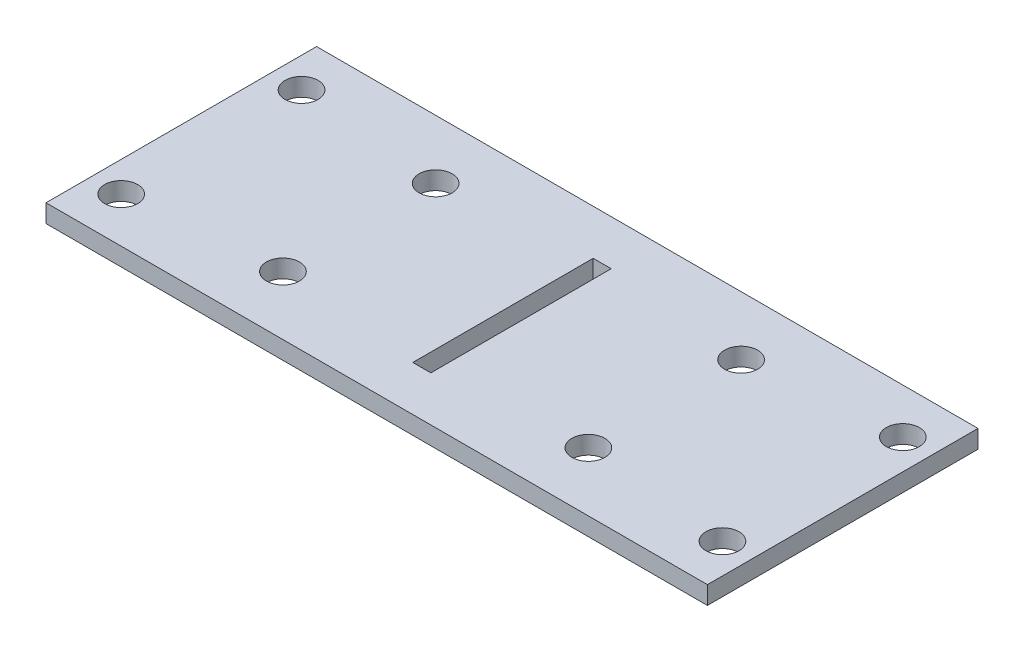
ISO-10303-21;
HEADER;
FILE_DESCRIPTION(('STEP AP214'),'2;1');
FILE_NAME('part.step','',(''),(''),'','','');
FILE_SCHEMA(('AUTOMOTIVE_DESIGN { 1 0 10303 214 1 1 1 1 }'));
ENDSEC;
DATA;
#1=APPLICATION_CONTEXT('core data for automotive mechanical design processes');
#2=APPLICATION_PROTOCOL_DEFINITION('international standard','automotive_design',2000,#1);
#3=PRODUCT_CONTEXT('',#1,'mechanical');
#4=PRODUCT('Part','Part','',(#3));
#5=PRODUCT_RELATED_PRODUCT_CATEGORY('part','',(#4));
#6=PRODUCT_DEFINITION_FORMATION('','',#4);
#7=PRODUCT_DEFINITION_CONTEXT('part definition',#1,'design');
#8=PRODUCT_DEFINITION('design','',#6,#7);
#9=PRODUCT_DEFINITION_SHAPE('','',#8);
#10=(LENGTH_UNIT() NAMED_UNIT(*) SI_UNIT(.MILLI.,.METRE.));
#11=(NAMED_UNIT(*) PLANE_ANGLE_UNIT() SI_UNIT($,.RADIAN.));
#12=(NAMED_UNIT(*) SI_UNIT($,.STERADIAN.) SOLID_ANGLE_UNIT());
#13=UNCERTAINTY_MEASURE_WITH_UNIT(LENGTH_MEASURE(1.E-05),#10,'distance_accuracy_value','');
#14=(GEOMETRIC_REPRESENTATION_CONTEXT(3) GLOBAL_UNCERTAINTY_ASSIGNED_CONTEXT((#13)) GLOBAL_UNIT_ASSIGNED_CONTEXT((#10,
#11,#12)) REPRESENTATION_CONTEXT('',''));
#15=CARTESIAN_POINT('',(0.,0.,0.));
#16=DIRECTION('',(0.,0.,1.));
#17=DIRECTION('',(1.,0.,0.));
#18=AXIS2_PLACEMENT_3D('',#15,#16,#17);
#19=CARTESIAN_POINT('',(0.,3.,0.));
#20=DIRECTION('',(0.,-1.,0.));
#21=DIRECTION('',(0.,0.,-1.));
#22=AXIS2_PLACEMENT_3D('',#19,#20,#21);
#23=PLANE('',#22);
#24=CARTESIAN_POINT('',(-25.4,3.,12.7));
#25=DIRECTION('',(0.,1.,0.));
#26=DIRECTION('',(0.,0.,1.));
#27=AXIS2_PLACEMENT_3D('',#24,#25,#26);
#28=CIRCLE('',#27,2.75);
#29=CARTESIAN_POINT('',(-25.4,3.,15.45));
#30=VERTEX_POINT('',#29);
#31=EDGE_CURVE('E288',#30,#30,#28,.T.);
#32=ORIENTED_EDGE('',*,*,#31,.F.);
#33=EDGE_LOOP('',(#32));
#34=FACE_BOUND('',#33,.T.);
#35=CARTESIAN_POINT('',(25.4,3.,-12.7));
#36=DIRECTION('',(0.,1.,0.));
#37=DIRECTION('',(0.,0.,1.));
#38=AXIS2_PLACEMENT_3D('',#35,#36,#37);
#39=CIRCLE('',#38,2.75);
#40=CARTESIAN_POINT('',(25.4,3.,-9.95));
#41=VERTEX_POINT('',#40);
#42=EDGE_CURVE('E292',#41,#41,#39,.T.);
#43=ORIENTED_EDGE('',*,*,#42,.F.);
#44=EDGE_LOOP('',(#43));
#45=FACE_BOUND('',#44,.T.);
#46=CARTESIAN_POINT('',(-25.4,3.,-12.7));
#47=DIRECTION('',(0.,1.,0.));
#48=DIRECTION('',(0.,0.,1.));
#49=AXIS2_PLACEMENT_3D('',#46,#47,#48);
#50=CIRCLE('',#49,2.75);
#51=CARTESIAN_POINT('',(-25.4,3.,-9.95));
#52=VERTEX_POINT('',#51);
#53=EDGE_CURVE('E302',#52,#52,#50,.T.);
#54=ORIENTED_EDGE('',*,*,#53,.F.);
#55=EDGE_LOOP('',(#54));
#56=FACE_BOUND('',#55,.T.);
#57=CARTESIAN_POINT('',(25.4,3.,12.7));
#58=DIRECTION('',(0.,1.,0.));
#59=DIRECTION('',(0.,0.,1.));
#60=AXIS2_PLACEMENT_3D('',#57,#58,#59);
#61=CIRCLE('',#60,2.75);
#62=CARTESIAN_POINT('',(25.4,3.,15.45));
#63=VERTEX_POINT('',#62);
#64=EDGE_CURVE('E310',#63,#63,#61,.T.);
#65=ORIENTED_EDGE('',*,*,#64,.F.);
#66=EDGE_LOOP('',(#65));
#67=FACE_BOUND('',#66,.T.);
#68=CARTESIAN_POINT('',(50.,3.,-15.));
#69=DIRECTION('',(0.,1.,0.));
#70=DIRECTION('',(0.,0.,1.));
#71=AXIS2_PLACEMENT_3D('',#68,#69,#70);
#72=CIRCLE('',#71,2.75);
#73=CARTESIAN_POINT('',(50.,3.,-12.25));
#74=VERTEX_POINT('',#73);
#75=EDGE_CURVE('E318',#74,#74,#72,.T.);
#76=ORIENTED_EDGE('',*,*,#75,.F.);
#77=EDGE_LOOP('',(#76));
#78=FACE_BOUND('',#77,.T.);
#79=CARTESIAN_POINT('',(-50.,3.,15.));
#80=DIRECTION('',(0.,1.,0.));
#81=DIRECTION('',(0.,0.,1.));
#82=AXIS2_PLACEMENT_3D('',#79,#80,#81);
#83=CIRCLE('',#82,2.75);
#84=CARTESIAN_POINT('',(-50.,3.,17.75));
#85=VERTEX_POINT('',#84);
#86=EDGE_CURVE('E326',#85,#85,#83,.T.);
#87=ORIENTED_EDGE('',*,*,#86,.F.);
#88=EDGE_LOOP('',(#87));
#89=FACE_BOUND('',#88,.T.);
#90=CARTESIAN_POINT('',(-50.,3.,-15.));
#91=DIRECTION('',(0.,1.,0.));
#92=DIRECTION('',(0.,0.,1.));
#93=AXIS2_PLACEMENT_3D('',#90,#91,#92);
#94=CIRCLE('',#93,2.75);
#95=CARTESIAN_POINT('',(-50.,3.,-12.25));
#96=VERTEX_POINT('',#95);
#97=EDGE_CURVE('E330',#96,#96,#94,.T.);
#98=ORIENTED_EDGE('',*,*,#97,.F.);
#99=EDGE_LOOP('',(#98));
#100=FACE_BOUND('',#99,.T.);
#101=CARTESIAN_POINT('',(50.,3.,15.));
#102=DIRECTION('',(0.,1.,0.));
#103=DIRECTION('',(0.,0.,1.));
#104=AXIS2_PLACEMENT_3D('',#101,#102,#103);
#105=CIRCLE('',#104,2.75);
#106=CARTESIAN_POINT('',(50.,3.,17.75));
#107=VERTEX_POINT('',#106);
#108=EDGE_CURVE('E338',#107,#107,#105,.T.);
#109=ORIENTED_EDGE('',*,*,#108,.F.);
#110=EDGE_LOOP('',(#109));
#111=FACE_BOUND('',#110,.T.);
#112=DIRECTION('',(0.,0.,-1.));
#113=VECTOR('',#112,1.);
#114=CARTESIAN_POINT('',(55.,3.,22.5));
#115=LINE('',#114,#113);
#116=CARTESIAN_POINT('',(55.,3.,22.5));
#117=VERTEX_POINT('',#116);
#118=CARTESIAN_POINT('',(55.,3.,-22.5));
#119=VERTEX_POINT('',#118);
#120=EDGE_CURVE('E158',#117,#119,#115,.T.);
#121=ORIENTED_EDGE('',*,*,#120,.T.);
#122=DIRECTION('',(-1.,0.,0.));
#123=VECTOR('',#122,1.);
#124=CARTESIAN_POINT('',(-55.,3.,-22.5));
#125=LINE('',#124,#123);
#126=CARTESIAN_POINT('',(-55.,3.,-22.5));
#127=VERTEX_POINT('',#126);
#128=EDGE_CURVE('E162',#119,#127,#125,.T.);
#129=ORIENTED_EDGE('',*,*,#128,.T.);
#130=DIRECTION('',(0.,0.,1.));
#131=VECTOR('',#130,1.);
#132=CARTESIAN_POINT('',(-55.,3.,22.5));
#133=LINE('',#132,#131);
#134=CARTESIAN_POINT('',(-55.,3.,22.5));
#135=VERTEX_POINT('',#134);
#136=EDGE_CURVE('E166',#127,#135,#133,.T.);
#137=ORIENTED_EDGE('',*,*,#136,.T.);
#138=DIRECTION('',(1.,0.,0.));
#139=VECTOR('',#138,1.);
#140=CARTESIAN_POINT('',(-55.,3.,22.5));
#141=LINE('',#140,#139);
#142=EDGE_CURVE('E169',#135,#117,#141,.T.);
#143=ORIENTED_EDGE('',*,*,#142,.T.);
#144=EDGE_LOOP('',(#121,#129,#137,#143));
#145=FACE_BOUND('',#144,.T.);
#146=DIRECTION('',(0.,0.,-1.));
#147=VECTOR('',#146,1.);
#148=CARTESIAN_POINT('',(1.49999999999998,3.,15.));
#149=LINE('',#148,#147);
#150=CARTESIAN_POINT('',(1.49999999999998,3.,15.));
#151=VERTEX_POINT('',#150);
#152=CARTESIAN_POINT('',(1.49999999999998,3.,-15.));
#153=VERTEX_POINT('',#152);
#154=EDGE_CURVE('E108',#151,#153,#149,.T.);
#155=ORIENTED_EDGE('',*,*,#154,.F.);
#156=DIRECTION('',(1.,0.,0.));
#157=VECTOR('',#156,1.);
#158=CARTESIAN_POINT('',(-1.50000000000002,3.,15.));
#159=LINE('',#158,#157);
#160=CARTESIAN_POINT('',(-1.50000000000002,3.,15.));
#161=VERTEX_POINT('',#160);
#162=EDGE_CURVE('E134',#161,#151,#159,.T.);
#163=ORIENTED_EDGE('',*,*,#162,.F.);
#164=DIRECTION('',(0.,0.,1.));
#165=VECTOR('',#164,1.);
#166=CARTESIAN_POINT('',(-1.50000000000002,3.,15.));
#167=LINE('',#166,#165);
#168=CARTESIAN_POINT('',(-1.50000000000002,3.,-15.));
#169=VERTEX_POINT('',#168);
#170=EDGE_CURVE('E130',#169,#161,#167,.T.);
#171=ORIENTED_EDGE('',*,*,#170,.F.);
#172=DIRECTION('',(-1.,0.,0.));
#173=VECTOR('',#172,1.);
#174=CARTESIAN_POINT('',(-1.50000000000002,3.,-15.));
#175=LINE('',#174,#173);
#176=EDGE_CURVE('E117',#153,#169,#175,.T.);
#177=ORIENTED_EDGE('',*,*,#176,.F.);
#178=EDGE_LOOP('',(#155,#163,#171,#177));
#179=FACE_BOUND('',#178,.T.);
#180=ADVANCED_FACE('F41',(#34,#45,#56,#67,#78,#89,#100,#111,#145,#179),#23,.F.);
#181=CARTESIAN_POINT('',(0.,0.,0.));
#182=DIRECTION('',(0.,-1.,0.));
#183=DIRECTION('',(0.,0.,-1.));
#184=AXIS2_PLACEMENT_3D('',#181,#182,#183);
#185=PLANE('',#184);
#186=CARTESIAN_POINT('',(-25.4,0.,12.7));
#187=DIRECTION('',(0.,1.,0.));
#188=DIRECTION('',(0.,0.,1.));
#189=AXIS2_PLACEMENT_3D('',#186,#187,#188);
#190=CIRCLE('',#189,2.75);
#191=CARTESIAN_POINT('',(-25.4,0.,15.45));
#192=VERTEX_POINT('',#191);
#193=EDGE_CURVE('E286',#192,#192,#190,.T.);
#194=ORIENTED_EDGE('',*,*,#193,.T.);
#195=EDGE_LOOP('',(#194));
#196=FACE_BOUND('',#195,.T.);
#197=CARTESIAN_POINT('',(25.4,0.,-12.7));
#198=DIRECTION('',(0.,1.,0.));
#199=DIRECTION('',(0.,0.,1.));
#200=AXIS2_PLACEMENT_3D('',#197,#198,#199);
#201=CIRCLE('',#200,2.75);
#202=CARTESIAN_POINT('',(25.4,0.,-9.95));
#203=VERTEX_POINT('',#202);
#204=EDGE_CURVE('E298',#203,#203,#201,.T.);
#205=ORIENTED_EDGE('',*,*,#204,.T.);
#206=EDGE_LOOP('',(#205));
#207=FACE_BOUND('',#206,.T.);
#208=CARTESIAN_POINT('',(-25.4,0.,-12.7));
#209=DIRECTION('',(0.,1.,0.));
#210=DIRECTION('',(0.,0.,1.));
#211=AXIS2_PLACEMENT_3D('',#208,#209,#210);
#212=CIRCLE('',#211,2.75);
#213=CARTESIAN_POINT('',(-25.4,0.,-9.95));
#214=VERTEX_POINT('',#213);
#215=EDGE_CURVE('E306',#214,#214,#212,.T.);
#216=ORIENTED_EDGE('',*,*,#215,.T.);
#217=EDGE_LOOP('',(#216));
#218=FACE_BOUND('',#217,.T.);
#219=CARTESIAN_POINT('',(25.4,0.,12.7));
#220=DIRECTION('',(0.,1.,0.));
#221=DIRECTION('',(0.,0.,1.));
#222=AXIS2_PLACEMENT_3D('',#219,#220,#221);
#223=CIRCLE('',#222,2.75);
#224=CARTESIAN_POINT('',(25.4,0.,15.45));
#225=VERTEX_POINT('',#224);
#226=EDGE_CURVE('E314',#225,#225,#223,.T.);
#227=ORIENTED_EDGE('',*,*,#226,.T.);
#228=EDGE_LOOP('',(#227));
#229=FACE_BOUND('',#228,.T.);
#230=CARTESIAN_POINT('',(50.,0.,-15.));
#231=DIRECTION('',(0.,-1.,0.));
#232=DIRECTION('',(0.,0.,-1.));
#233=AXIS2_PLACEMENT_3D('',#230,#231,#232);
#234=CIRCLE('',#233,2.75);
#235=CARTESIAN_POINT('',(50.,0.,-17.75));
#236=VERTEX_POINT('',#235);
#237=EDGE_CURVE('E322',#236,#236,#234,.T.);
#238=ORIENTED_EDGE('',*,*,#237,.F.);
#239=EDGE_LOOP('',(#238));
#240=FACE_BOUND('',#239,.T.);
#241=CARTESIAN_POINT('',(-50.,0.,15.));
#242=DIRECTION('',(0.,-1.,0.));
#243=DIRECTION('',(0.,0.,-1.));
#244=AXIS2_PLACEMENT_3D('',#241,#242,#243);
#245=CIRCLE('',#244,2.75);
#246=CARTESIAN_POINT('',(-50.,0.,12.25));
#247=VERTEX_POINT('',#246);
#248=EDGE_CURVE('E45',#247,#247,#245,.T.);
#249=ORIENTED_EDGE('',*,*,#248,.F.);
#250=EDGE_LOOP('',(#249));
#251=FACE_BOUND('',#250,.T.);
#252=CARTESIAN_POINT('',(-50.,0.,-15.));
#253=DIRECTION('',(0.,-1.,0.));
#254=DIRECTION('',(0.,0.,-1.));
#255=AXIS2_PLACEMENT_3D('',#252,#253,#254);
#256=CIRCLE('',#255,2.75);
#257=CARTESIAN_POINT('',(-50.,0.,-17.75));
#258=VERTEX_POINT('',#257);
#259=EDGE_CURVE('E334',#258,#258,#256,.T.);
#260=ORIENTED_EDGE('',*,*,#259,.F.);
#261=EDGE_LOOP('',(#260));
#262=FACE_BOUND('',#261,.T.);
#263=CARTESIAN_POINT('',(50.,0.,15.));
#264=DIRECTION('',(0.,-1.,0.));
#265=DIRECTION('',(0.,0.,-1.));
#266=AXIS2_PLACEMENT_3D('',#263,#264,#265);
#267=CIRCLE('',#266,2.75);
#268=CARTESIAN_POINT('',(50.,0.,12.25));
#269=VERTEX_POINT('',#268);
#270=EDGE_CURVE('E142',#269,#269,#267,.T.);
#271=ORIENTED_EDGE('',*,*,#270,.F.);
#272=EDGE_LOOP('',(#271));
#273=FACE_BOUND('',#272,.T.);
#274=DIRECTION('',(0.,0.,-1.));
#275=VECTOR('',#274,1.);
#276=CARTESIAN_POINT('',(55.,0.,22.5));
#277=LINE('',#276,#275);
#278=CARTESIAN_POINT('',(55.,0.,22.5));
#279=VERTEX_POINT('',#278);
#280=CARTESIAN_POINT('',(55.,0.,-22.5));
#281=VERTEX_POINT('',#280);
#282=EDGE_CURVE('E126',#279,#281,#277,.T.);
#283=ORIENTED_EDGE('',*,*,#282,.F.);
#284=DIRECTION('',(1.,0.,0.));
#285=VECTOR('',#284,1.);
#286=CARTESIAN_POINT('',(-55.,0.,22.5));
#287=LINE('',#286,#285);
#288=CARTESIAN_POINT('',(-55.,0.,22.5));
#289=VERTEX_POINT('',#288);
#290=EDGE_CURVE('E163',#289,#279,#287,.T.);
#291=ORIENTED_EDGE('',*,*,#290,.F.);
#292=DIRECTION('',(0.,0.,1.));
#293=VECTOR('',#292,1.);
#294=CARTESIAN_POINT('',(-55.,0.,22.5));
#295=LINE('',#294,#293);
#296=CARTESIAN_POINT('',(-55.,0.,-22.5));
#297=VERTEX_POINT('',#296);
#298=EDGE_CURVE('E179',#297,#289,#295,.T.);
#299=ORIENTED_EDGE('',*,*,#298,.F.);
#300=DIRECTION('',(-1.,0.,0.));
#301=VECTOR('',#300,1.);
#302=CARTESIAN_POINT('',(-55.,0.,-22.5));
#303=LINE('',#302,#301);
#304=EDGE_CURVE('E176',#281,#297,#303,.T.);
#305=ORIENTED_EDGE('',*,*,#304,.F.);
#306=EDGE_LOOP('',(#283,#291,#299,#305));
#307=FACE_BOUND('',#306,.T.);
#308=DIRECTION('',(1.,0.,0.));
#309=VECTOR('',#308,1.);
#310=CARTESIAN_POINT('',(-1.50000000000002,0.,15.));
#311=LINE('',#310,#309);
#312=CARTESIAN_POINT('',(-1.50000000000002,0.,15.));
#313=VERTEX_POINT('',#312);
#314=CARTESIAN_POINT('',(1.49999999999998,0.,15.));
#315=VERTEX_POINT('',#314);
#316=EDGE_CURVE('E118',#313,#315,#311,.T.);
#317=ORIENTED_EDGE('',*,*,#316,.T.);
#318=DIRECTION('',(0.,0.,-1.));
#319=VECTOR('',#318,1.);
#320=CARTESIAN_POINT('',(1.49999999999998,0.,15.));
#321=LINE('',#320,#319);
#322=CARTESIAN_POINT('',(1.49999999999998,0.,-15.));
#323=VERTEX_POINT('',#322);
#324=EDGE_CURVE('E66',#315,#323,#321,.T.);
#325=ORIENTED_EDGE('',*,*,#324,.T.);
#326=DIRECTION('',(-1.,0.,0.));
#327=VECTOR('',#326,1.);
#328=CARTESIAN_POINT('',(-1.50000000000002,0.,-15.));
#329=LINE('',#328,#327);
#330=CARTESIAN_POINT('',(-1.50000000000002,0.,-15.));
#331=VERTEX_POINT('',#330);
#332=EDGE_CURVE('E124',#323,#331,#329,.T.);
#333=ORIENTED_EDGE('',*,*,#332,.T.);
#334=DIRECTION('',(0.,0.,1.));
#335=VECTOR('',#334,1.);
#336=CARTESIAN_POINT('',(-1.50000000000002,0.,15.));
#337=LINE('',#336,#335);
#338=EDGE_CURVE('E145',#331,#313,#337,.T.);
#339=ORIENTED_EDGE('',*,*,#338,.T.);
#340=EDGE_LOOP('',(#317,#325,#333,#339));
#341=FACE_BOUND('',#340,.T.);
#342=ADVANCED_FACE('F203',(#196,#207,#218,#229,#240,#251,#262,#273,#307,#341),#185,.T.);
#343=CARTESIAN_POINT('',(55.,3.,22.5));
#344=DIRECTION('',(-1.,0.,0.));
#345=DIRECTION('',(0.,0.,1.));
#346=AXIS2_PLACEMENT_3D('',#343,#344,#345);
#347=PLANE('',#346);
#348=ORIENTED_EDGE('',*,*,#282,.T.);
#349=DIRECTION('',(0.,-1.,0.));
#350=VECTOR('',#349,1.);
#351=CARTESIAN_POINT('',(55.,3.,-22.5));
#352=LINE('',#351,#350);
#353=EDGE_CURVE('E11',#119,#281,#352,.T.);
#354=ORIENTED_EDGE('',*,*,#353,.F.);
#355=ORIENTED_EDGE('',*,*,#120,.F.);
#356=DIRECTION('',(0.,-1.,0.));
#357=VECTOR('',#356,1.);
#358=CARTESIAN_POINT('',(55.,3.,22.5));
#359=LINE('',#358,#357);
#360=EDGE_CURVE('E172',#117,#279,#359,.T.);
#361=ORIENTED_EDGE('',*,*,#360,.T.);
#362=EDGE_LOOP('',(#348,#354,#355,#361));
#363=FACE_BOUND('',#362,.T.);
#364=ADVANCED_FACE('F43',(#363),#347,.F.);
#365=CARTESIAN_POINT('',(-55.,3.,-22.5));
#366=DIRECTION('',(0.,0.,1.));
#367=DIRECTION('',(1.,0.,0.));
#368=AXIS2_PLACEMENT_3D('',#365,#366,#367);
#369=PLANE('',#368);
#370=ORIENTED_EDGE('',*,*,#304,.T.);
#371=DIRECTION('',(0.,-1.,0.));
#372=VECTOR('',#371,1.);
#373=CARTESIAN_POINT('',(-55.,3.,-22.5));
#374=LINE('',#373,#372);
#375=EDGE_CURVE('E51',#127,#297,#374,.T.);
#376=ORIENTED_EDGE('',*,*,#375,.F.);
#377=ORIENTED_EDGE('',*,*,#128,.F.);
#378=ORIENTED_EDGE('',*,*,#353,.T.);
#379=EDGE_LOOP('',(#370,#376,#377,#378));
#380=FACE_BOUND('',#379,.T.);
#381=ADVANCED_FACE('F213',(#380),#369,.F.);
#382=CARTESIAN_POINT('',(-55.,3.,22.5));
#383=DIRECTION('',(1.,0.,0.));
#384=DIRECTION('',(0.,0.,-1.));
#385=AXIS2_PLACEMENT_3D('',#382,#383,#384);
#386=PLANE('',#385);
#387=ORIENTED_EDGE('',*,*,#298,.T.);
#388=DIRECTION('',(0.,-1.,0.));
#389=VECTOR('',#388,1.);
#390=CARTESIAN_POINT('',(-55.,3.,22.5));
#391=LINE('',#390,#389);
#392=EDGE_CURVE('E187',#135,#289,#391,.T.);
#393=ORIENTED_EDGE('',*,*,#392,.F.);
#394=ORIENTED_EDGE('',*,*,#136,.F.);
#395=ORIENTED_EDGE('',*,*,#375,.T.);
#396=EDGE_LOOP('',(#387,#393,#394,#395));
#397=FACE_BOUND('',#396,.T.);
#398=ADVANCED_FACE('F197',(#397),#386,.F.);
#399=CARTESIAN_POINT('',(-55.,3.,22.5));
#400=DIRECTION('',(0.,0.,-1.));
#401=DIRECTION('',(-1.,0.,0.));
#402=AXIS2_PLACEMENT_3D('',#399,#400,#401);
#403=PLANE('',#402);
#404=ORIENTED_EDGE('',*,*,#290,.T.);
#405=ORIENTED_EDGE('',*,*,#360,.F.);
#406=ORIENTED_EDGE('',*,*,#142,.F.);
#407=ORIENTED_EDGE('',*,*,#392,.T.);
#408=EDGE_LOOP('',(#404,#405,#406,#407));
#409=FACE_BOUND('',#408,.T.);
#410=ADVANCED_FACE('F207',(#409),#403,.F.);
#411=CARTESIAN_POINT('',(1.49999999999998,3.,15.));
#412=DIRECTION('',(-1.,0.,0.));
#413=DIRECTION('',(0.,0.,1.));
#414=AXIS2_PLACEMENT_3D('',#411,#412,#413);
#415=PLANE('',#414);
#416=ORIENTED_EDGE('',*,*,#324,.F.);
#417=DIRECTION('',(0.,-1.,0.));
#418=VECTOR('',#417,1.);
#419=CARTESIAN_POINT('',(1.49999999999998,3.,15.));
#420=LINE('',#419,#418);
#421=EDGE_CURVE('E112',#151,#315,#420,.T.);
#422=ORIENTED_EDGE('',*,*,#421,.F.);
#423=ORIENTED_EDGE('',*,*,#154,.T.);
#424=DIRECTION('',(0.,-1.,0.));
#425=VECTOR('',#424,1.);
#426=CARTESIAN_POINT('',(1.49999999999998,3.,-15.));
#427=LINE('',#426,#425);
#428=EDGE_CURVE('E111',#153,#323,#427,.T.);
#429=ORIENTED_EDGE('',*,*,#428,.T.);
#430=EDGE_LOOP('',(#416,#422,#423,#429));
#431=FACE_BOUND('',#430,.T.);
#432=ADVANCED_FACE('F110',(#431),#415,.T.);
#433=CARTESIAN_POINT('',(-1.50000000000002,3.,-15.));
#434=DIRECTION('',(0.,0.,1.));
#435=DIRECTION('',(1.,0.,0.));
#436=AXIS2_PLACEMENT_3D('',#433,#434,#435);
#437=PLANE('',#436);
#438=ORIENTED_EDGE('',*,*,#332,.F.);
#439=ORIENTED_EDGE('',*,*,#428,.F.);
#440=ORIENTED_EDGE('',*,*,#176,.T.);
#441=DIRECTION('',(0.,-1.,0.));
#442=VECTOR('',#441,1.);
#443=CARTESIAN_POINT('',(-1.50000000000002,3.,-15.));
#444=LINE('',#443,#442);
#445=EDGE_CURVE('E127',#169,#331,#444,.T.);
#446=ORIENTED_EDGE('',*,*,#445,.T.);
#447=EDGE_LOOP('',(#438,#439,#440,#446));
#448=FACE_BOUND('',#447,.T.);
#449=ADVANCED_FACE('F121',(#448),#437,.T.);
#450=CARTESIAN_POINT('',(-1.50000000000002,3.,15.));
#451=DIRECTION('',(1.,0.,0.));
#452=DIRECTION('',(0.,0.,-1.));
#453=AXIS2_PLACEMENT_3D('',#450,#451,#452);
#454=PLANE('',#453);
#455=ORIENTED_EDGE('',*,*,#338,.F.);
#456=ORIENTED_EDGE('',*,*,#445,.F.);
#457=ORIENTED_EDGE('',*,*,#170,.T.);
#458=DIRECTION('',(0.,-1.,0.));
#459=VECTOR('',#458,1.);
#460=CARTESIAN_POINT('',(-1.50000000000002,3.,15.));
#461=LINE('',#460,#459);
#462=EDGE_CURVE('E58',#161,#313,#461,.T.);
#463=ORIENTED_EDGE('',*,*,#462,.T.);
#464=EDGE_LOOP('',(#455,#456,#457,#463));
#465=FACE_BOUND('',#464,.T.);
#466=ADVANCED_FACE('F240',(#465),#454,.T.);
#467=CARTESIAN_POINT('',(-1.50000000000002,3.,15.));
#468=DIRECTION('',(0.,0.,-1.));
#469=DIRECTION('',(-1.,0.,0.));
#470=AXIS2_PLACEMENT_3D('',#467,#468,#469);
#471=PLANE('',#470);
#472=ORIENTED_EDGE('',*,*,#316,.F.);
#473=ORIENTED_EDGE('',*,*,#462,.F.);
#474=ORIENTED_EDGE('',*,*,#162,.T.);
#475=ORIENTED_EDGE('',*,*,#421,.T.);
#476=EDGE_LOOP('',(#472,#473,#474,#475));
#477=FACE_BOUND('',#476,.T.);
#478=ADVANCED_FACE('F244',(#477),#471,.T.);
#479=CARTESIAN_POINT('',(50.,3.,15.));
#480=DIRECTION('',(0.,1.,0.));
#481=DIRECTION('',(0.,0.,1.));
#482=AXIS2_PLACEMENT_3D('',#479,#480,#481);
#483=CYLINDRICAL_SURFACE('',#482,2.75);
#484=ORIENTED_EDGE('',*,*,#270,.T.);
#485=EDGE_LOOP('',(#484));
#486=FACE_BOUND('',#485,.T.);
#487=ORIENTED_EDGE('',*,*,#108,.T.);
#488=EDGE_LOOP('',(#487));
#489=FACE_BOUND('',#488,.T.);
#490=ADVANCED_FACE('F250',(#486,#489),#483,.F.);
#491=CARTESIAN_POINT('',(-50.,3.,-15.));
#492=DIRECTION('',(0.,1.,0.));
#493=DIRECTION('',(0.,0.,1.));
#494=AXIS2_PLACEMENT_3D('',#491,#492,#493);
#495=CYLINDRICAL_SURFACE('',#494,2.75);
#496=ORIENTED_EDGE('',*,*,#259,.T.);
#497=EDGE_LOOP('',(#496));
#498=FACE_BOUND('',#497,.T.);
#499=ORIENTED_EDGE('',*,*,#97,.T.);
#500=EDGE_LOOP('',(#499));
#501=FACE_BOUND('',#500,.T.);
#502=ADVANCED_FACE('F253',(#498,#501),#495,.F.);
#503=CARTESIAN_POINT('',(-50.,3.,15.));
#504=DIRECTION('',(0.,1.,0.));
#505=DIRECTION('',(0.,0.,1.));
#506=AXIS2_PLACEMENT_3D('',#503,#504,#505);
#507=CYLINDRICAL_SURFACE('',#506,2.75);
#508=ORIENTED_EDGE('',*,*,#248,.T.);
#509=EDGE_LOOP('',(#508));
#510=FACE_BOUND('',#509,.T.);
#511=ORIENTED_EDGE('',*,*,#86,.T.);
#512=EDGE_LOOP('',(#511));
#513=FACE_BOUND('',#512,.T.);
#514=ADVANCED_FACE('F257',(#510,#513),#507,.F.);
#515=CARTESIAN_POINT('',(50.,3.,-15.));
#516=DIRECTION('',(0.,1.,0.));
#517=DIRECTION('',(0.,0.,1.));
#518=AXIS2_PLACEMENT_3D('',#515,#516,#517);
#519=CYLINDRICAL_SURFACE('',#518,2.75);
#520=ORIENTED_EDGE('',*,*,#237,.T.);
#521=EDGE_LOOP('',(#520));
#522=FACE_BOUND('',#521,.T.);
#523=ORIENTED_EDGE('',*,*,#75,.T.);
#524=EDGE_LOOP('',(#523));
#525=FACE_BOUND('',#524,.T.);
#526=ADVANCED_FACE('F261',(#522,#525),#519,.F.);
#527=CARTESIAN_POINT('',(25.4,3.,12.7));
#528=DIRECTION('',(0.,1.,0.));
#529=DIRECTION('',(0.,0.,1.));
#530=AXIS2_PLACEMENT_3D('',#527,#528,#529);
#531=CYLINDRICAL_SURFACE('',#530,2.75);
#532=ORIENTED_EDGE('',*,*,#226,.F.);
#533=EDGE_LOOP('',(#532));
#534=FACE_BOUND('',#533,.T.);
#535=ORIENTED_EDGE('',*,*,#64,.T.);
#536=EDGE_LOOP('',(#535));
#537=FACE_BOUND('',#536,.T.);
#538=ADVANCED_FACE('F265',(#534,#537),#531,.F.);
#539=CARTESIAN_POINT('',(-25.4,3.,-12.7));
#540=DIRECTION('',(0.,1.,0.));
#541=DIRECTION('',(0.,0.,1.));
#542=AXIS2_PLACEMENT_3D('',#539,#540,#541);
#543=CYLINDRICAL_SURFACE('',#542,2.75);
#544=ORIENTED_EDGE('',*,*,#215,.F.);
#545=EDGE_LOOP('',(#544));
#546=FACE_BOUND('',#545,.T.);
#547=ORIENTED_EDGE('',*,*,#53,.T.);
#548=EDGE_LOOP('',(#547));
#549=FACE_BOUND('',#548,.T.);
#550=ADVANCED_FACE('F269',(#546,#549),#543,.F.);
#551=CARTESIAN_POINT('',(25.4,3.,-12.7));
#552=DIRECTION('',(0.,1.,0.));
#553=DIRECTION('',(0.,0.,1.));
#554=AXIS2_PLACEMENT_3D('',#551,#552,#553);
#555=CYLINDRICAL_SURFACE('',#554,2.75);
#556=ORIENTED_EDGE('',*,*,#204,.F.);
#557=EDGE_LOOP('',(#556));
#558=FACE_BOUND('',#557,.T.);
#559=ORIENTED_EDGE('',*,*,#42,.T.);
#560=EDGE_LOOP('',(#559));
#561=FACE_BOUND('',#560,.T.);
#562=ADVANCED_FACE('F273',(#558,#561),#555,.F.);
#563=CARTESIAN_POINT('',(-25.4,3.,12.7));
#564=DIRECTION('',(0.,1.,0.));
#565=DIRECTION('',(0.,0.,1.));
#566=AXIS2_PLACEMENT_3D('',#563,#564,#565);
#567=CYLINDRICAL_SURFACE('',#566,2.75);
#568=ORIENTED_EDGE('',*,*,#193,.F.);
#569=EDGE_LOOP('',(#568));
#570=FACE_BOUND('',#569,.T.);
#571=ORIENTED_EDGE('',*,*,#31,.T.);
#572=EDGE_LOOP('',(#571));
#573=FACE_BOUND('',#572,.T.);
#574=ADVANCED_FACE('F277',(#570,#573),#567,.F.);
#575=CLOSED_SHELL('',(#180,#342,#364,#381,#398,#410,#432,#449,#466,#478,#490,#502,#514,#526,
#538,#550,#562,#574));
#576=MANIFOLD_SOLID_BREP('B2',#575);
#577=ADVANCED_BREP_SHAPE_REPRESENTATION('',(#18,#576),#14);
#578=SHAPE_DEFINITION_REPRESENTATION(#9,#577);
ENDSEC;
END-ISO-10303-21;
